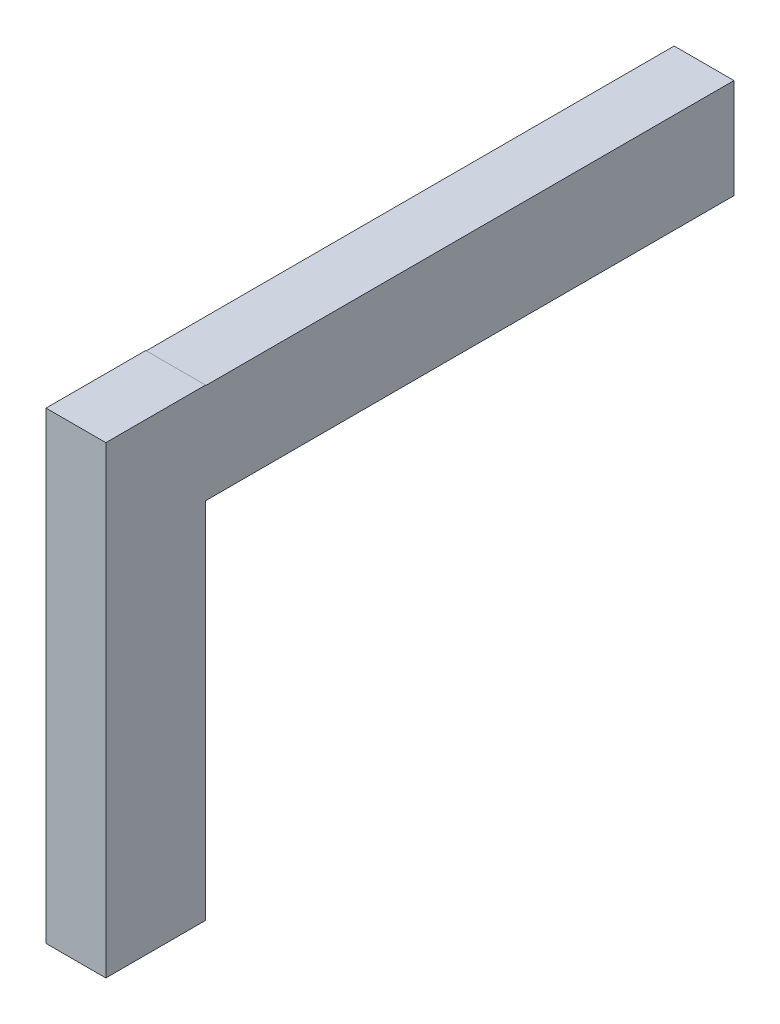
ISO-10303-21;
HEADER;
FILE_DESCRIPTION(('STEP AP214'),'2;1');
FILE_NAME('part.step','',(''),(''),'','','');
FILE_SCHEMA(('AUTOMOTIVE_DESIGN { 1 0 10303 214 1 1 1 1 }'));
ENDSEC;
DATA;
#1=APPLICATION_CONTEXT('core data for automotive mechanical design processes');
#2=APPLICATION_PROTOCOL_DEFINITION('international standard','automotive_design',2000,#1);
#3=PRODUCT_CONTEXT('',#1,'mechanical');
#4=PRODUCT('Part','Part','',(#3));
#5=PRODUCT_RELATED_PRODUCT_CATEGORY('part','',(#4));
#6=PRODUCT_DEFINITION_FORMATION('','',#4);
#7=PRODUCT_DEFINITION_CONTEXT('part definition',#1,'design');
#8=PRODUCT_DEFINITION('design','',#6,#7);
#9=PRODUCT_DEFINITION_SHAPE('','',#8);
#10=(LENGTH_UNIT() NAMED_UNIT(*) SI_UNIT(.MILLI.,.METRE.));
#11=(NAMED_UNIT(*) PLANE_ANGLE_UNIT() SI_UNIT($,.RADIAN.));
#12=(NAMED_UNIT(*) SI_UNIT($,.STERADIAN.) SOLID_ANGLE_UNIT());
#13=UNCERTAINTY_MEASURE_WITH_UNIT(LENGTH_MEASURE(1.E-05),#10,'distance_accuracy_value','');
#14=(GEOMETRIC_REPRESENTATION_CONTEXT(3) GLOBAL_UNCERTAINTY_ASSIGNED_CONTEXT((#13)) GLOBAL_UNIT_ASSIGNED_CONTEXT((#10,
#11,#12)) REPRESENTATION_CONTEXT('',''));
#15=CARTESIAN_POINT('',(0.,0.,0.));
#16=DIRECTION('',(0.,0.,1.));
#17=DIRECTION('',(1.,0.,0.));
#18=AXIS2_PLACEMENT_3D('',#15,#16,#17);
#19=CARTESIAN_POINT('',(-30.,1645.5,-1576.));
#20=DIRECTION('',(0.,0.,1.));
#21=DIRECTION('',(0.,1.,0.));
#22=AXIS2_PLACEMENT_3D('',#19,#20,#21);
#23=PLANE('',#22);
#24=DIRECTION('',(0.,-1.,0.));
#25=VECTOR('',#24,1.);
#26=CARTESIAN_POINT('',(-30.,1645.5,-1576.));
#27=LINE('',#26,#25);
#28=CARTESIAN_POINT('',(-30.,1545.,-1576.));
#29=VERTEX_POINT('',#28);
#30=CARTESIAN_POINT('',(-30.,1180.5,-1576.));
#31=VERTEX_POINT('',#30);
#32=EDGE_CURVE('E32',#29,#31,#27,.T.);
#33=ORIENTED_EDGE('',*,*,#32,.F.);
#34=DIRECTION('',(1.,0.,0.));
#35=VECTOR('',#34,1.);
#36=CARTESIAN_POINT('',(-30.,1545.,-1576.));
#37=LINE('',#36,#35);
#38=CARTESIAN_POINT('',(30.,1545.,-1576.));
#39=VERTEX_POINT('',#38);
#40=EDGE_CURVE('E100',#29,#39,#37,.T.);
#41=ORIENTED_EDGE('',*,*,#40,.T.);
#42=DIRECTION('',(0.,-1.,0.));
#43=VECTOR('',#42,1.);
#44=CARTESIAN_POINT('',(30.,1645.5,-1576.));
#45=LINE('',#44,#43);
#46=CARTESIAN_POINT('',(30.,1180.5,-1576.));
#47=VERTEX_POINT('',#46);
#48=EDGE_CURVE('E118',#39,#47,#45,.T.);
#49=ORIENTED_EDGE('',*,*,#48,.T.);
#50=DIRECTION('',(1.,0.,0.));
#51=VECTOR('',#50,1.);
#52=CARTESIAN_POINT('',(-30.,1180.5,-1576.));
#53=LINE('',#52,#51);
#54=EDGE_CURVE('E11',#31,#47,#53,.T.);
#55=ORIENTED_EDGE('',*,*,#54,.F.);
#56=EDGE_LOOP('',(#33,#41,#49,#55));
#57=FACE_BOUND('',#56,.T.);
#58=ADVANCED_FACE('F17',(#57),#23,.F.);
#59=CARTESIAN_POINT('',(30.,1645.5,-1576.));
#60=VERTEX_POINT('',#59);
#61=CARTESIAN_POINT('',(30.,1645.,-1576.));
#62=VERTEX_POINT('',#61);
#63=EDGE_CURVE('E122',#60,#62,#45,.T.);
#64=ORIENTED_EDGE('',*,*,#63,.T.);
#65=DIRECTION('',(-1.,0.,0.));
#66=VECTOR('',#65,1.);
#67=CARTESIAN_POINT('',(-30.,1645.,-1576.));
#68=LINE('',#67,#66);
#69=CARTESIAN_POINT('',(-30.,1645.,-1576.));
#70=VERTEX_POINT('',#69);
#71=EDGE_CURVE('E40',#62,#70,#68,.T.);
#72=ORIENTED_EDGE('',*,*,#71,.T.);
#73=CARTESIAN_POINT('',(-30.,1645.5,-1576.));
#74=VERTEX_POINT('',#73);
#75=EDGE_CURVE('E130',#74,#70,#27,.T.);
#76=ORIENTED_EDGE('',*,*,#75,.F.);
#77=DIRECTION('',(1.,0.,0.));
#78=VECTOR('',#77,1.);
#79=CARTESIAN_POINT('',(-30.,1645.5,-1576.));
#80=LINE('',#79,#78);
#81=EDGE_CURVE('E134',#74,#60,#80,.T.);
#82=ORIENTED_EDGE('',*,*,#81,.T.);
#83=EDGE_LOOP('',(#64,#72,#76,#82));
#84=FACE_BOUND('',#83,.T.);
#85=ADVANCED_FACE('F19',(#84),#23,.F.);
#86=CARTESIAN_POINT('',(-30.,1180.5,-1576.));
#87=DIRECTION('',(0.,1.,0.));
#88=DIRECTION('',(0.,0.,-1.));
#89=AXIS2_PLACEMENT_3D('',#86,#87,#88);
#90=PLANE('',#89);
#91=DIRECTION('',(0.,0.,1.));
#92=VECTOR('',#91,1.);
#93=CARTESIAN_POINT('',(30.,1180.5,-1576.));
#94=LINE('',#93,#92);
#95=CARTESIAN_POINT('',(30.,1180.5,-1476.));
#96=VERTEX_POINT('',#95);
#97=EDGE_CURVE('E119',#47,#96,#94,.T.);
#98=ORIENTED_EDGE('',*,*,#97,.T.);
#99=DIRECTION('',(1.,0.,0.));
#100=VECTOR('',#99,1.);
#101=CARTESIAN_POINT('',(-30.,1180.5,-1476.));
#102=LINE('',#101,#100);
#103=CARTESIAN_POINT('',(-30.,1180.5,-1476.));
#104=VERTEX_POINT('',#103);
#105=EDGE_CURVE('E25',#104,#96,#102,.T.);
#106=ORIENTED_EDGE('',*,*,#105,.F.);
#107=DIRECTION('',(0.,0.,1.));
#108=VECTOR('',#107,1.);
#109=CARTESIAN_POINT('',(-30.,1180.5,-1576.));
#110=LINE('',#109,#108);
#111=EDGE_CURVE('E127',#31,#104,#110,.T.);
#112=ORIENTED_EDGE('',*,*,#111,.F.);
#113=ORIENTED_EDGE('',*,*,#54,.T.);
#114=EDGE_LOOP('',(#98,#106,#112,#113));
#115=FACE_BOUND('',#114,.T.);
#116=ADVANCED_FACE('F166',(#115),#90,.F.);
#117=CARTESIAN_POINT('',(-30.,1180.5,-1476.));
#118=DIRECTION('',(0.,0.,-1.));
#119=DIRECTION('',(0.,-1.,0.));
#120=AXIS2_PLACEMENT_3D('',#117,#118,#119);
#121=PLANE('',#120);
#122=DIRECTION('',(1.,0.,0.));
#123=VECTOR('',#122,1.);
#124=CARTESIAN_POINT('',(-30.,1645.5,-1476.));
#125=LINE('',#124,#123);
#126=CARTESIAN_POINT('',(-30.,1645.5,-1476.));
#127=VERTEX_POINT('',#126);
#128=CARTESIAN_POINT('',(30.,1645.5,-1476.));
#129=VERTEX_POINT('',#128);
#130=EDGE_CURVE('E138',#127,#129,#125,.T.);
#131=ORIENTED_EDGE('',*,*,#130,.F.);
#132=DIRECTION('',(0.,1.,0.));
#133=VECTOR('',#132,1.);
#134=CARTESIAN_POINT('',(-30.,1180.5,-1476.));
#135=LINE('',#134,#133);
#136=EDGE_CURVE('E129',#104,#127,#135,.T.);
#137=ORIENTED_EDGE('',*,*,#136,.F.);
#138=ORIENTED_EDGE('',*,*,#105,.T.);
#139=DIRECTION('',(0.,1.,0.));
#140=VECTOR('',#139,1.);
#141=CARTESIAN_POINT('',(30.,1180.5,-1476.));
#142=LINE('',#141,#140);
#143=EDGE_CURVE('E121',#96,#129,#142,.T.);
#144=ORIENTED_EDGE('',*,*,#143,.T.);
#145=EDGE_LOOP('',(#131,#137,#138,#144));
#146=FACE_BOUND('',#145,.T.);
#147=ADVANCED_FACE('F146',(#146),#121,.F.);
#148=CARTESIAN_POINT('',(-30.,1645.5,-1476.));
#149=DIRECTION('',(0.,-1.,0.));
#150=DIRECTION('',(0.,0.,1.));
#151=AXIS2_PLACEMENT_3D('',#148,#149,#150);
#152=PLANE('',#151);
#153=DIRECTION('',(0.,0.,-1.));
#154=VECTOR('',#153,1.);
#155=CARTESIAN_POINT('',(30.,1645.5,-1476.));
#156=LINE('',#155,#154);
#157=EDGE_CURVE('E124',#129,#60,#156,.T.);
#158=ORIENTED_EDGE('',*,*,#157,.T.);
#159=ORIENTED_EDGE('',*,*,#81,.F.);
#160=DIRECTION('',(0.,0.,-1.));
#161=VECTOR('',#160,1.);
#162=CARTESIAN_POINT('',(-30.,1645.5,-1476.));
#163=LINE('',#162,#161);
#164=EDGE_CURVE('E132',#127,#74,#163,.T.);
#165=ORIENTED_EDGE('',*,*,#164,.F.);
#166=ORIENTED_EDGE('',*,*,#130,.T.);
#167=EDGE_LOOP('',(#158,#159,#165,#166));
#168=FACE_BOUND('',#167,.T.);
#169=ADVANCED_FACE('F157',(#168),#152,.F.);
#170=CARTESIAN_POINT('',(-30.,1645.5,-1576.));
#171=DIRECTION('',(1.,0.,0.));
#172=DIRECTION('',(0.,0.,1.));
#173=AXIS2_PLACEMENT_3D('',#170,#171,#172);
#174=PLANE('',#173);
#175=ORIENTED_EDGE('',*,*,#75,.T.);
#176=DIRECTION('',(0.,0.,-1.));
#177=VECTOR('',#176,1.);
#178=CARTESIAN_POINT('',(-30.,1645.,-1476.));
#179=LINE('',#178,#177);
#180=CARTESIAN_POINT('',(-29.9999999999995,1645.,-2106.));
#181=VERTEX_POINT('',#180);
#182=EDGE_CURVE('E102',#70,#181,#179,.T.);
#183=ORIENTED_EDGE('',*,*,#182,.T.);
#184=DIRECTION('',(0.,-1.,0.));
#185=VECTOR('',#184,1.);
#186=CARTESIAN_POINT('',(-29.9999999999995,1645.,-2106.));
#187=LINE('',#186,#185);
#188=CARTESIAN_POINT('',(-29.9999999999995,1545.,-2106.));
#189=VERTEX_POINT('',#188);
#190=EDGE_CURVE('E89',#181,#189,#187,.T.);
#191=ORIENTED_EDGE('',*,*,#190,.T.);
#192=DIRECTION('',(0.,0.,1.));
#193=VECTOR('',#192,1.);
#194=CARTESIAN_POINT('',(-29.9999999999995,1545.,-2106.));
#195=LINE('',#194,#193);
#196=EDGE_CURVE('E98',#189,#29,#195,.T.);
#197=ORIENTED_EDGE('',*,*,#196,.T.);
#198=ORIENTED_EDGE('',*,*,#32,.T.);
#199=ORIENTED_EDGE('',*,*,#111,.T.);
#200=ORIENTED_EDGE('',*,*,#136,.T.);
#201=ORIENTED_EDGE('',*,*,#164,.T.);
#202=EDGE_LOOP('',(#175,#183,#191,#197,#198,#199,#200,#201));
#203=FACE_BOUND('',#202,.T.);
#204=ADVANCED_FACE('F104',(#203),#174,.F.);
#205=CARTESIAN_POINT('',(30.,1645.5,-1576.));
#206=DIRECTION('',(1.,0.,0.));
#207=DIRECTION('',(0.,0.,1.));
#208=AXIS2_PLACEMENT_3D('',#205,#206,#207);
#209=PLANE('',#208);
#210=ORIENTED_EDGE('',*,*,#48,.F.);
#211=DIRECTION('',(0.,0.,1.));
#212=VECTOR('',#211,1.);
#213=CARTESIAN_POINT('',(30.0000000000005,1545.,-2106.));
#214=LINE('',#213,#212);
#215=CARTESIAN_POINT('',(30.0000000000005,1545.,-2106.));
#216=VERTEX_POINT('',#215);
#217=EDGE_CURVE('E110',#216,#39,#214,.T.);
#218=ORIENTED_EDGE('',*,*,#217,.F.);
#219=DIRECTION('',(0.,-1.,0.));
#220=VECTOR('',#219,1.);
#221=CARTESIAN_POINT('',(30.0000000000005,1645.,-2106.));
#222=LINE('',#221,#220);
#223=CARTESIAN_POINT('',(30.0000000000005,1645.,-2106.));
#224=VERTEX_POINT('',#223);
#225=EDGE_CURVE('E91',#224,#216,#222,.T.);
#226=ORIENTED_EDGE('',*,*,#225,.F.);
#227=DIRECTION('',(0.,0.,-1.));
#228=VECTOR('',#227,1.);
#229=CARTESIAN_POINT('',(30.,1645.,-1476.));
#230=LINE('',#229,#228);
#231=EDGE_CURVE('E112',#62,#224,#230,.T.);
#232=ORIENTED_EDGE('',*,*,#231,.F.);
#233=ORIENTED_EDGE('',*,*,#63,.F.);
#234=ORIENTED_EDGE('',*,*,#157,.F.);
#235=ORIENTED_EDGE('',*,*,#143,.F.);
#236=ORIENTED_EDGE('',*,*,#97,.F.);
#237=EDGE_LOOP('',(#210,#218,#226,#232,#233,#234,#235,#236));
#238=FACE_BOUND('',#237,.T.);
#239=ADVANCED_FACE('F152',(#238),#209,.T.);
#240=CARTESIAN_POINT('',(30.0000000000005,1545.,-2106.));
#241=DIRECTION('',(0.,-1.,0.));
#242=DIRECTION('',(0.,0.,-1.));
#243=AXIS2_PLACEMENT_3D('',#240,#241,#242);
#244=PLANE('',#243);
#245=ORIENTED_EDGE('',*,*,#40,.F.);
#246=ORIENTED_EDGE('',*,*,#196,.F.);
#247=DIRECTION('',(-1.,0.,0.));
#248=VECTOR('',#247,1.);
#249=CARTESIAN_POINT('',(30.0000000000005,1545.,-2106.));
#250=LINE('',#249,#248);
#251=EDGE_CURVE('E84',#216,#189,#250,.T.);
#252=ORIENTED_EDGE('',*,*,#251,.F.);
#253=ORIENTED_EDGE('',*,*,#217,.T.);
#254=EDGE_LOOP('',(#245,#246,#252,#253));
#255=FACE_BOUND('',#254,.T.);
#256=ADVANCED_FACE('F99',(#255),#244,.T.);
#257=CARTESIAN_POINT('',(30.,1645.,-1476.));
#258=DIRECTION('',(0.,1.,0.));
#259=DIRECTION('',(0.,0.,1.));
#260=AXIS2_PLACEMENT_3D('',#257,#258,#259);
#261=PLANE('',#260);
#262=ORIENTED_EDGE('',*,*,#71,.F.);
#263=ORIENTED_EDGE('',*,*,#231,.T.);
#264=DIRECTION('',(-1.,0.,0.));
#265=VECTOR('',#264,1.);
#266=CARTESIAN_POINT('',(30.0000000000005,1645.,-2106.));
#267=LINE('',#266,#265);
#268=EDGE_CURVE('E95',#224,#181,#267,.T.);
#269=ORIENTED_EDGE('',*,*,#268,.T.);
#270=ORIENTED_EDGE('',*,*,#182,.F.);
#271=EDGE_LOOP('',(#262,#263,#269,#270));
#272=FACE_BOUND('',#271,.T.);
#273=ADVANCED_FACE('F160',(#272),#261,.T.);
#274=CARTESIAN_POINT('',(30.0000000000005,1645.,-2106.));
#275=DIRECTION('',(0.,0.,-1.));
#276=DIRECTION('',(0.,1.,0.));
#277=AXIS2_PLACEMENT_3D('',#274,#275,#276);
#278=PLANE('',#277);
#279=ORIENTED_EDGE('',*,*,#190,.F.);
#280=ORIENTED_EDGE('',*,*,#268,.F.);
#281=ORIENTED_EDGE('',*,*,#225,.T.);
#282=ORIENTED_EDGE('',*,*,#251,.T.);
#283=EDGE_LOOP('',(#279,#280,#281,#282));
#284=FACE_BOUND('',#283,.T.);
#285=ADVANCED_FACE('F86',(#284),#278,.T.);
#286=CLOSED_SHELL('',(#58,#85,#116,#147,#169,#204,#239,#256,#273,#285));
#287=MANIFOLD_SOLID_BREP('B1',#286);
#288=ADVANCED_BREP_SHAPE_REPRESENTATION('',(#18,#287),#14);
#289=SHAPE_DEFINITION_REPRESENTATION(#9,#288);
ENDSEC;
END-ISO-10303-21;
